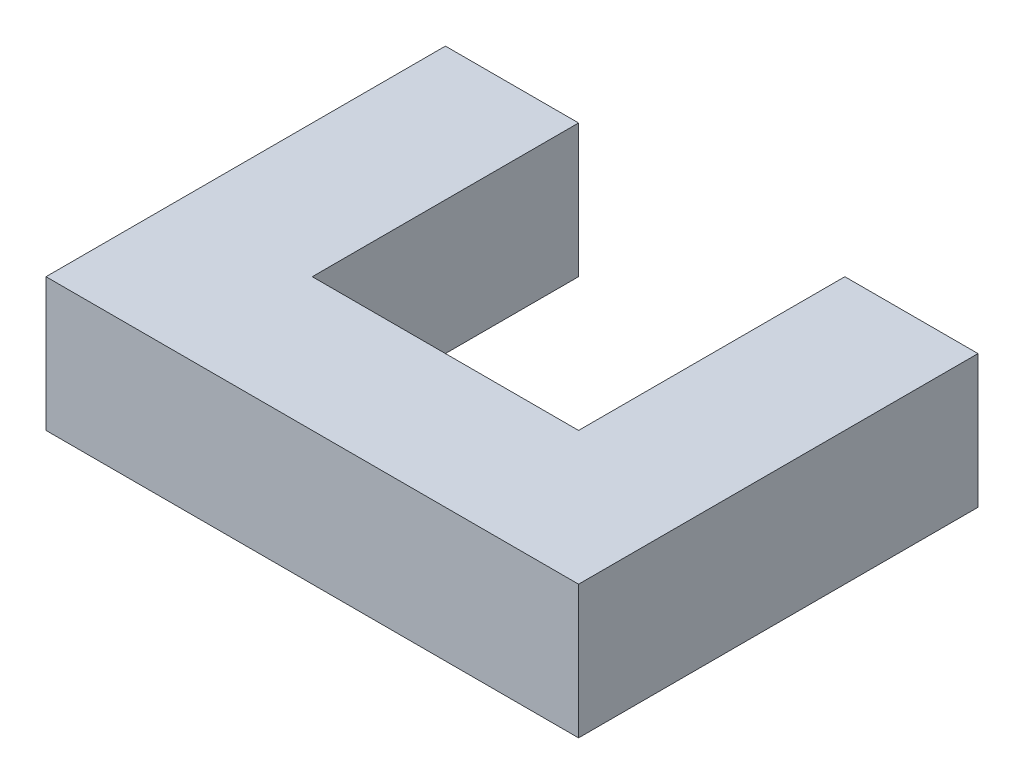
ISO-10303-21;
HEADER;
FILE_DESCRIPTION(('STEP AP214'),'2;1');
FILE_NAME('part.step','',(''),(''),'','','');
FILE_SCHEMA(('AUTOMOTIVE_DESIGN { 1 0 10303 214 1 1 1 1 }'));
ENDSEC;
DATA;
#1=APPLICATION_CONTEXT('core data for automotive mechanical design processes');
#2=APPLICATION_PROTOCOL_DEFINITION('international standard','automotive_design',2000,#1);
#3=PRODUCT_CONTEXT('',#1,'mechanical');
#4=PRODUCT('Part','Part','',(#3));
#5=PRODUCT_RELATED_PRODUCT_CATEGORY('part','',(#4));
#6=PRODUCT_DEFINITION_FORMATION('','',#4);
#7=PRODUCT_DEFINITION_CONTEXT('part definition',#1,'design');
#8=PRODUCT_DEFINITION('design','',#6,#7);
#9=PRODUCT_DEFINITION_SHAPE('','',#8);
#10=(LENGTH_UNIT() NAMED_UNIT(*) SI_UNIT(.MILLI.,.METRE.));
#11=(NAMED_UNIT(*) PLANE_ANGLE_UNIT() SI_UNIT($,.RADIAN.));
#12=(NAMED_UNIT(*) SI_UNIT($,.STERADIAN.) SOLID_ANGLE_UNIT());
#13=UNCERTAINTY_MEASURE_WITH_UNIT(LENGTH_MEASURE(1.E-05),#10,'distance_accuracy_value','');
#14=(GEOMETRIC_REPRESENTATION_CONTEXT(3) GLOBAL_UNCERTAINTY_ASSIGNED_CONTEXT((#13)) GLOBAL_UNIT_ASSIGNED_CONTEXT((#10,
#11,#12)) REPRESENTATION_CONTEXT('',''));
#15=CARTESIAN_POINT('',(0.,0.,0.));
#16=DIRECTION('',(0.,0.,1.));
#17=DIRECTION('',(1.,0.,0.));
#18=AXIS2_PLACEMENT_3D('',#15,#16,#17);
#19=CARTESIAN_POINT('',(0.,10.,-30.));
#20=DIRECTION('',(-1.,0.,0.));
#21=DIRECTION('',(0.,0.,1.));
#22=AXIS2_PLACEMENT_3D('',#19,#20,#21);
#23=PLANE('',#22);
#24=DIRECTION('',(0.,0.,-1.));
#25=VECTOR('',#24,1.);
#26=CARTESIAN_POINT('',(0.,0.,-30.));
#27=LINE('',#26,#25);
#28=CARTESIAN_POINT('',(0.,0.,0.));
#29=VERTEX_POINT('',#28);
#30=CARTESIAN_POINT('',(0.,0.,-30.));
#31=VERTEX_POINT('',#30);
#32=EDGE_CURVE('E129',#29,#31,#27,.T.);
#33=ORIENTED_EDGE('',*,*,#32,.T.);
#34=DIRECTION('',(0.,-1.,0.));
#35=VECTOR('',#34,1.);
#36=CARTESIAN_POINT('',(0.,10.,-30.));
#37=LINE('',#36,#35);
#38=CARTESIAN_POINT('',(0.,10.,-30.));
#39=VERTEX_POINT('',#38);
#40=EDGE_CURVE('E11',#39,#31,#37,.T.);
#41=ORIENTED_EDGE('',*,*,#40,.F.);
#42=DIRECTION('',(0.,0.,-1.));
#43=VECTOR('',#42,1.);
#44=CARTESIAN_POINT('',(0.,10.,-30.));
#45=LINE('',#44,#43);
#46=CARTESIAN_POINT('',(0.,10.,0.));
#47=VERTEX_POINT('',#46);
#48=EDGE_CURVE('E143',#47,#39,#45,.T.);
#49=ORIENTED_EDGE('',*,*,#48,.F.);
#50=DIRECTION('',(0.,-1.,0.));
#51=VECTOR('',#50,1.);
#52=CARTESIAN_POINT('',(0.,10.,0.));
#53=LINE('',#52,#51);
#54=EDGE_CURVE('E125',#47,#29,#53,.T.);
#55=ORIENTED_EDGE('',*,*,#54,.T.);
#56=EDGE_LOOP('',(#33,#41,#49,#55));
#57=FACE_BOUND('',#56,.T.);
#58=ADVANCED_FACE('F33',(#57),#23,.F.);
#59=CARTESIAN_POINT('',(-10.,10.,-30.));
#60=DIRECTION('',(0.,0.,1.));
#61=DIRECTION('',(1.,0.,0.));
#62=AXIS2_PLACEMENT_3D('',#59,#60,#61);
#63=PLANE('',#62);
#64=DIRECTION('',(-1.,0.,0.));
#65=VECTOR('',#64,1.);
#66=CARTESIAN_POINT('',(-10.,0.,-30.));
#67=LINE('',#66,#65);
#68=CARTESIAN_POINT('',(-10.,0.,-30.));
#69=VERTEX_POINT('',#68);
#70=EDGE_CURVE('E132',#31,#69,#67,.T.);
#71=ORIENTED_EDGE('',*,*,#70,.T.);
#72=DIRECTION('',(0.,-1.,0.));
#73=VECTOR('',#72,1.);
#74=CARTESIAN_POINT('',(-10.,10.,-30.));
#75=LINE('',#74,#73);
#76=CARTESIAN_POINT('',(-10.,10.,-30.));
#77=VERTEX_POINT('',#76);
#78=EDGE_CURVE('E41',#77,#69,#75,.T.);
#79=ORIENTED_EDGE('',*,*,#78,.F.);
#80=DIRECTION('',(-1.,0.,0.));
#81=VECTOR('',#80,1.);
#82=CARTESIAN_POINT('',(-10.,10.,-30.));
#83=LINE('',#82,#81);
#84=EDGE_CURVE('E92',#39,#77,#83,.T.);
#85=ORIENTED_EDGE('',*,*,#84,.F.);
#86=ORIENTED_EDGE('',*,*,#40,.T.);
#87=EDGE_LOOP('',(#71,#79,#85,#86));
#88=FACE_BOUND('',#87,.T.);
#89=ADVANCED_FACE('F178',(#88),#63,.F.);
#90=CARTESIAN_POINT('',(-10.,10.,-9.99999999999999));
#91=DIRECTION('',(1.,0.,0.));
#92=DIRECTION('',(0.,0.,-1.));
#93=AXIS2_PLACEMENT_3D('',#90,#91,#92);
#94=PLANE('',#93);
#95=DIRECTION('',(0.,0.,1.));
#96=VECTOR('',#95,1.);
#97=CARTESIAN_POINT('',(-10.,0.,-9.99999999999999));
#98=LINE('',#97,#96);
#99=CARTESIAN_POINT('',(-10.,0.,-9.99999999999999));
#100=VERTEX_POINT('',#99);
#101=EDGE_CURVE('E134',#69,#100,#98,.T.);
#102=ORIENTED_EDGE('',*,*,#101,.T.);
#103=DIRECTION('',(0.,-1.,0.));
#104=VECTOR('',#103,1.);
#105=CARTESIAN_POINT('',(-10.,10.,-9.99999999999999));
#106=LINE('',#105,#104);
#107=CARTESIAN_POINT('',(-10.,10.,-9.99999999999999));
#108=VERTEX_POINT('',#107);
#109=EDGE_CURVE('E150',#108,#100,#106,.T.);
#110=ORIENTED_EDGE('',*,*,#109,.F.);
#111=DIRECTION('',(0.,0.,1.));
#112=VECTOR('',#111,1.);
#113=CARTESIAN_POINT('',(-10.,10.,-9.99999999999999));
#114=LINE('',#113,#112);
#115=EDGE_CURVE('E158',#77,#108,#114,.T.);
#116=ORIENTED_EDGE('',*,*,#115,.F.);
#117=ORIENTED_EDGE('',*,*,#78,.T.);
#118=EDGE_LOOP('',(#102,#110,#116,#117));
#119=FACE_BOUND('',#118,.T.);
#120=ADVANCED_FACE('F156',(#119),#94,.F.);
#121=CARTESIAN_POINT('',(-30.,10.,-9.99999999999999));
#122=DIRECTION('',(0.,0.,1.));
#123=DIRECTION('',(1.,0.,0.));
#124=AXIS2_PLACEMENT_3D('',#121,#122,#123);
#125=PLANE('',#124);
#126=DIRECTION('',(-1.,0.,0.));
#127=VECTOR('',#126,1.);
#128=CARTESIAN_POINT('',(-30.,0.,-9.99999999999999));
#129=LINE('',#128,#127);
#130=CARTESIAN_POINT('',(-30.,0.,-9.99999999999999));
#131=VERTEX_POINT('',#130);
#132=EDGE_CURVE('E136',#100,#131,#129,.T.);
#133=ORIENTED_EDGE('',*,*,#132,.T.);
#134=DIRECTION('',(0.,-1.,0.));
#135=VECTOR('',#134,1.);
#136=CARTESIAN_POINT('',(-30.,10.,-9.99999999999999));
#137=LINE('',#136,#135);
#138=CARTESIAN_POINT('',(-30.,10.,-9.99999999999999));
#139=VERTEX_POINT('',#138);
#140=EDGE_CURVE('E147',#139,#131,#137,.T.);
#141=ORIENTED_EDGE('',*,*,#140,.F.);
#142=DIRECTION('',(-1.,0.,0.));
#143=VECTOR('',#142,1.);
#144=CARTESIAN_POINT('',(-30.,10.,-9.99999999999999));
#145=LINE('',#144,#143);
#146=EDGE_CURVE('E170',#108,#139,#145,.T.);
#147=ORIENTED_EDGE('',*,*,#146,.F.);
#148=ORIENTED_EDGE('',*,*,#109,.T.);
#149=EDGE_LOOP('',(#133,#141,#147,#148));
#150=FACE_BOUND('',#149,.T.);
#151=ADVANCED_FACE('F166',(#150),#125,.F.);
#152=CARTESIAN_POINT('',(-30.,10.,-30.));
#153=DIRECTION('',(-1.,0.,0.));
#154=DIRECTION('',(0.,0.,1.));
#155=AXIS2_PLACEMENT_3D('',#152,#153,#154);
#156=PLANE('',#155);
#157=DIRECTION('',(0.,0.,-1.));
#158=VECTOR('',#157,1.);
#159=CARTESIAN_POINT('',(-30.,0.,-30.));
#160=LINE('',#159,#158);
#161=CARTESIAN_POINT('',(-30.,0.,-30.));
#162=VERTEX_POINT('',#161);
#163=EDGE_CURVE('E138',#131,#162,#160,.T.);
#164=ORIENTED_EDGE('',*,*,#163,.T.);
#165=DIRECTION('',(0.,-1.,0.));
#166=VECTOR('',#165,1.);
#167=CARTESIAN_POINT('',(-30.,10.,-30.));
#168=LINE('',#167,#166);
#169=CARTESIAN_POINT('',(-30.,10.,-30.));
#170=VERTEX_POINT('',#169);
#171=EDGE_CURVE('E120',#170,#162,#168,.T.);
#172=ORIENTED_EDGE('',*,*,#171,.F.);
#173=DIRECTION('',(0.,0.,-1.));
#174=VECTOR('',#173,1.);
#175=CARTESIAN_POINT('',(-30.,10.,-30.));
#176=LINE('',#175,#174);
#177=EDGE_CURVE('E111',#139,#170,#176,.T.);
#178=ORIENTED_EDGE('',*,*,#177,.F.);
#179=ORIENTED_EDGE('',*,*,#140,.T.);
#180=EDGE_LOOP('',(#164,#172,#178,#179));
#181=FACE_BOUND('',#180,.T.);
#182=ADVANCED_FACE('F169',(#181),#156,.F.);
#183=CARTESIAN_POINT('',(-40.,10.,-30.));
#184=DIRECTION('',(0.,0.,1.));
#185=DIRECTION('',(1.,0.,0.));
#186=AXIS2_PLACEMENT_3D('',#183,#184,#185);
#187=PLANE('',#186);
#188=DIRECTION('',(-1.,0.,0.));
#189=VECTOR('',#188,1.);
#190=CARTESIAN_POINT('',(-40.,0.,-30.));
#191=LINE('',#190,#189);
#192=CARTESIAN_POINT('',(-40.,0.,-30.));
#193=VERTEX_POINT('',#192);
#194=EDGE_CURVE('E119',#162,#193,#191,.T.);
#195=ORIENTED_EDGE('',*,*,#194,.T.);
#196=DIRECTION('',(0.,-1.,0.));
#197=VECTOR('',#196,1.);
#198=CARTESIAN_POINT('',(-40.,10.,-30.));
#199=LINE('',#198,#197);
#200=CARTESIAN_POINT('',(-40.,10.,-30.));
#201=VERTEX_POINT('',#200);
#202=EDGE_CURVE('E116',#201,#193,#199,.T.);
#203=ORIENTED_EDGE('',*,*,#202,.F.);
#204=DIRECTION('',(-1.,0.,0.));
#205=VECTOR('',#204,1.);
#206=CARTESIAN_POINT('',(-40.,10.,-30.));
#207=LINE('',#206,#205);
#208=EDGE_CURVE('E105',#170,#201,#207,.T.);
#209=ORIENTED_EDGE('',*,*,#208,.F.);
#210=ORIENTED_EDGE('',*,*,#171,.T.);
#211=EDGE_LOOP('',(#195,#203,#209,#210));
#212=FACE_BOUND('',#211,.T.);
#213=ADVANCED_FACE('F117',(#212),#187,.F.);
#214=CARTESIAN_POINT('',(-40.,10.,0.));
#215=DIRECTION('',(1.,0.,0.));
#216=DIRECTION('',(0.,0.,-1.));
#217=AXIS2_PLACEMENT_3D('',#214,#215,#216);
#218=PLANE('',#217);
#219=DIRECTION('',(0.,0.,1.));
#220=VECTOR('',#219,1.);
#221=CARTESIAN_POINT('',(-40.,0.,0.));
#222=LINE('',#221,#220);
#223=CARTESIAN_POINT('',(-40.,0.,0.));
#224=VERTEX_POINT('',#223);
#225=EDGE_CURVE('E78',#193,#224,#222,.T.);
#226=ORIENTED_EDGE('',*,*,#225,.T.);
#227=DIRECTION('',(0.,-1.,0.));
#228=VECTOR('',#227,1.);
#229=CARTESIAN_POINT('',(-40.,10.,0.));
#230=LINE('',#229,#228);
#231=CARTESIAN_POINT('',(-40.,10.,0.));
#232=VERTEX_POINT('',#231);
#233=EDGE_CURVE('E121',#232,#224,#230,.T.);
#234=ORIENTED_EDGE('',*,*,#233,.F.);
#235=DIRECTION('',(0.,0.,1.));
#236=VECTOR('',#235,1.);
#237=CARTESIAN_POINT('',(-40.,10.,0.));
#238=LINE('',#237,#236);
#239=EDGE_CURVE('E109',#201,#232,#238,.T.);
#240=ORIENTED_EDGE('',*,*,#239,.F.);
#241=ORIENTED_EDGE('',*,*,#202,.T.);
#242=EDGE_LOOP('',(#226,#234,#240,#241));
#243=FACE_BOUND('',#242,.T.);
#244=ADVANCED_FACE('F123',(#243),#218,.F.);
#245=CARTESIAN_POINT('',(0.,10.,0.));
#246=DIRECTION('',(0.,0.,-1.));
#247=DIRECTION('',(-1.,0.,0.));
#248=AXIS2_PLACEMENT_3D('',#245,#246,#247);
#249=PLANE('',#248);
#250=DIRECTION('',(1.,0.,0.));
#251=VECTOR('',#250,1.);
#252=CARTESIAN_POINT('',(0.,0.,0.));
#253=LINE('',#252,#251);
#254=EDGE_CURVE('E84',#224,#29,#253,.T.);
#255=ORIENTED_EDGE('',*,*,#254,.T.);
#256=ORIENTED_EDGE('',*,*,#54,.F.);
#257=DIRECTION('',(1.,0.,0.));
#258=VECTOR('',#257,1.);
#259=CARTESIAN_POINT('',(0.,10.,0.));
#260=LINE('',#259,#258);
#261=EDGE_CURVE('E49',#232,#47,#260,.T.);
#262=ORIENTED_EDGE('',*,*,#261,.F.);
#263=ORIENTED_EDGE('',*,*,#233,.T.);
#264=EDGE_LOOP('',(#255,#256,#262,#263));
#265=FACE_BOUND('',#264,.T.);
#266=ADVANCED_FACE('F194',(#265),#249,.F.);
#267=CARTESIAN_POINT('',(0.,10.,0.));
#268=DIRECTION('',(0.,-1.,0.));
#269=DIRECTION('',(0.,0.,-1.));
#270=AXIS2_PLACEMENT_3D('',#267,#268,#269);
#271=PLANE('',#270);
#272=ORIENTED_EDGE('',*,*,#48,.T.);
#273=ORIENTED_EDGE('',*,*,#84,.T.);
#274=ORIENTED_EDGE('',*,*,#115,.T.);
#275=ORIENTED_EDGE('',*,*,#146,.T.);
#276=ORIENTED_EDGE('',*,*,#177,.T.);
#277=ORIENTED_EDGE('',*,*,#208,.T.);
#278=ORIENTED_EDGE('',*,*,#239,.T.);
#279=ORIENTED_EDGE('',*,*,#261,.T.);
#280=EDGE_LOOP('',(#272,#273,#274,#275,#276,#277,#278,#279));
#281=FACE_BOUND('',#280,.T.);
#282=ADVANCED_FACE('F107',(#281),#271,.F.);
#283=CARTESIAN_POINT('',(0.,0.,0.));
#284=DIRECTION('',(0.,-1.,0.));
#285=DIRECTION('',(0.,0.,-1.));
#286=AXIS2_PLACEMENT_3D('',#283,#284,#285);
#287=PLANE('',#286);
#288=ORIENTED_EDGE('',*,*,#32,.F.);
#289=ORIENTED_EDGE('',*,*,#254,.F.);
#290=ORIENTED_EDGE('',*,*,#225,.F.);
#291=ORIENTED_EDGE('',*,*,#194,.F.);
#292=ORIENTED_EDGE('',*,*,#163,.F.);
#293=ORIENTED_EDGE('',*,*,#132,.F.);
#294=ORIENTED_EDGE('',*,*,#101,.F.);
#295=ORIENTED_EDGE('',*,*,#70,.F.);
#296=EDGE_LOOP('',(#288,#289,#290,#291,#292,#293,#294,#295));
#297=FACE_BOUND('',#296,.T.);
#298=ADVANCED_FACE('F162',(#297),#287,.T.);
#299=CLOSED_SHELL('',(#58,#89,#120,#151,#182,#213,#244,#266,#282,#298));
#300=MANIFOLD_SOLID_BREP('B2',#299);
#301=ADVANCED_BREP_SHAPE_REPRESENTATION('',(#18,#300),#14);
#302=SHAPE_DEFINITION_REPRESENTATION(#9,#301);
ENDSEC;
END-ISO-10303-21;
